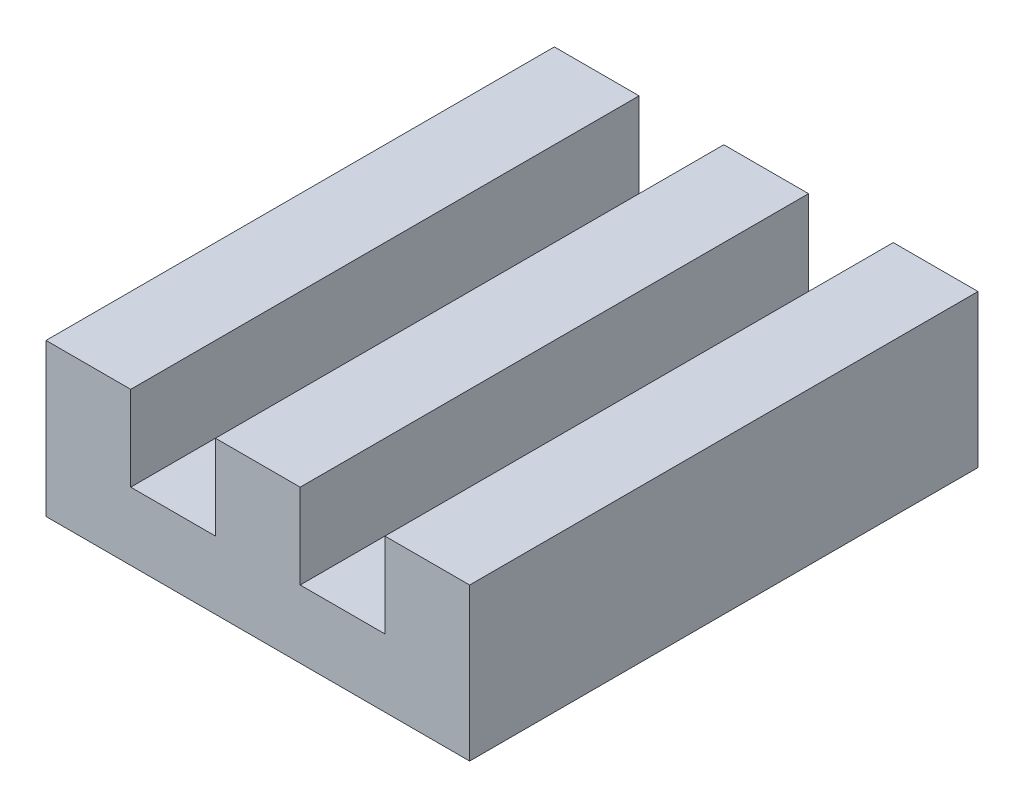
ISO-10303-21;
HEADER;
FILE_DESCRIPTION(('STEP AP214'),'2;1');
FILE_NAME('part.step','',(''),(''),'','','');
FILE_SCHEMA(('AUTOMOTIVE_DESIGN { 1 0 10303 214 1 1 1 1 }'));
ENDSEC;
DATA;
#1=APPLICATION_CONTEXT('core data for automotive mechanical design processes');
#2=APPLICATION_PROTOCOL_DEFINITION('international standard','automotive_design',2000,#1);
#3=PRODUCT_CONTEXT('',#1,'mechanical');
#4=PRODUCT('Part','Part','',(#3));
#5=PRODUCT_RELATED_PRODUCT_CATEGORY('part','',(#4));
#6=PRODUCT_DEFINITION_FORMATION('','',#4);
#7=PRODUCT_DEFINITION_CONTEXT('part definition',#1,'design');
#8=PRODUCT_DEFINITION('design','',#6,#7);
#9=PRODUCT_DEFINITION_SHAPE('','',#8);
#10=(LENGTH_UNIT() NAMED_UNIT(*) SI_UNIT(.MILLI.,.METRE.));
#11=(NAMED_UNIT(*) PLANE_ANGLE_UNIT() SI_UNIT($,.RADIAN.));
#12=(NAMED_UNIT(*) SI_UNIT($,.STERADIAN.) SOLID_ANGLE_UNIT());
#13=UNCERTAINTY_MEASURE_WITH_UNIT(LENGTH_MEASURE(1.E-05),#10,'distance_accuracy_value','');
#14=(GEOMETRIC_REPRESENTATION_CONTEXT(3) GLOBAL_UNCERTAINTY_ASSIGNED_CONTEXT((#13)) GLOBAL_UNIT_ASSIGNED_CONTEXT((#10,
#11,#12)) REPRESENTATION_CONTEXT('',''));
#15=CARTESIAN_POINT('',(0.,0.,0.));
#16=DIRECTION('',(0.,0.,1.));
#17=DIRECTION('',(1.,0.,0.));
#18=AXIS2_PLACEMENT_3D('',#15,#16,#17);
#19=CARTESIAN_POINT('',(50.,18.,60.));
#20=DIRECTION('',(0.,-1.,0.));
#21=DIRECTION('',(1.,0.,0.));
#22=AXIS2_PLACEMENT_3D('',#19,#20,#21);
#23=PLANE('',#22);
#24=DIRECTION('',(-1.,0.,0.));
#25=VECTOR('',#24,1.);
#26=CARTESIAN_POINT('',(50.,18.,60.));
#27=LINE('',#26,#25);
#28=CARTESIAN_POINT('',(30.,18.,60.));
#29=VERTEX_POINT('',#28);
#30=CARTESIAN_POINT('',(20.,18.,60.));
#31=VERTEX_POINT('',#30);
#32=EDGE_CURVE('E137',#29,#31,#27,.T.);
#33=ORIENTED_EDGE('',*,*,#32,.F.);
#34=DIRECTION('',(0.,0.,1.));
#35=VECTOR('',#34,1.);
#36=CARTESIAN_POINT('',(30.,18.,-4.94652419989347));
#37=LINE('',#36,#35);
#38=CARTESIAN_POINT('',(30.,18.,0.));
#39=VERTEX_POINT('',#38);
#40=EDGE_CURVE('E125',#39,#29,#37,.T.);
#41=ORIENTED_EDGE('',*,*,#40,.F.);
#42=DIRECTION('',(-1.,0.,0.));
#43=VECTOR('',#42,1.);
#44=CARTESIAN_POINT('',(50.,18.,0.));
#45=LINE('',#44,#43);
#46=CARTESIAN_POINT('',(20.,18.,0.));
#47=VERTEX_POINT('',#46);
#48=EDGE_CURVE('E135',#39,#47,#45,.T.);
#49=ORIENTED_EDGE('',*,*,#48,.T.);
#50=DIRECTION('',(0.,0.,-1.));
#51=VECTOR('',#50,1.);
#52=CARTESIAN_POINT('',(20.,18.,-4.94652419989347));
#53=LINE('',#52,#51);
#54=EDGE_CURVE('E209',#31,#47,#53,.T.);
#55=ORIENTED_EDGE('',*,*,#54,.F.);
#56=EDGE_LOOP('',(#33,#41,#49,#55));
#57=FACE_BOUND('',#56,.T.);
#58=ADVANCED_FACE('F35',(#57),#23,.F.);
#59=CARTESIAN_POINT('',(10.,18.,60.));
#60=VERTEX_POINT('',#59);
#61=CARTESIAN_POINT('',(0.,18.,60.));
#62=VERTEX_POINT('',#61);
#63=EDGE_CURVE('E196',#60,#62,#27,.T.);
#64=ORIENTED_EDGE('',*,*,#63,.F.);
#65=DIRECTION('',(0.,0.,1.));
#66=VECTOR('',#65,1.);
#67=CARTESIAN_POINT('',(10.,18.,-4.94652419989347));
#68=LINE('',#67,#66);
#69=CARTESIAN_POINT('',(10.,18.,0.));
#70=VERTEX_POINT('',#69);
#71=EDGE_CURVE('E212',#70,#60,#68,.T.);
#72=ORIENTED_EDGE('',*,*,#71,.F.);
#73=CARTESIAN_POINT('',(0.,18.,0.));
#74=VERTEX_POINT('',#73);
#75=EDGE_CURVE('E145',#70,#74,#45,.T.);
#76=ORIENTED_EDGE('',*,*,#75,.T.);
#77=DIRECTION('',(0.,0.,-1.));
#78=VECTOR('',#77,1.);
#79=CARTESIAN_POINT('',(0.,18.,60.));
#80=LINE('',#79,#78);
#81=EDGE_CURVE('E153',#62,#74,#80,.T.);
#82=ORIENTED_EDGE('',*,*,#81,.F.);
#83=EDGE_LOOP('',(#64,#72,#76,#82));
#84=FACE_BOUND('',#83,.T.);
#85=ADVANCED_FACE('F241',(#84),#23,.F.);
#86=CARTESIAN_POINT('',(0.,18.,60.));
#87=DIRECTION('',(1.,0.,0.));
#88=DIRECTION('',(0.,1.,0.));
#89=AXIS2_PLACEMENT_3D('',#86,#87,#88);
#90=PLANE('',#89);
#91=DIRECTION('',(0.,-1.,0.));
#92=VECTOR('',#91,1.);
#93=CARTESIAN_POINT('',(0.,18.,0.));
#94=LINE('',#93,#92);
#95=CARTESIAN_POINT('',(0.,0.,0.));
#96=VERTEX_POINT('',#95);
#97=EDGE_CURVE('E189',#74,#96,#94,.T.);
#98=ORIENTED_EDGE('',*,*,#97,.T.);
#99=DIRECTION('',(0.,0.,-1.));
#100=VECTOR('',#99,1.);
#101=CARTESIAN_POINT('',(0.,0.,60.));
#102=LINE('',#101,#100);
#103=CARTESIAN_POINT('',(0.,0.,60.));
#104=VERTEX_POINT('',#103);
#105=EDGE_CURVE('E163',#104,#96,#102,.T.);
#106=ORIENTED_EDGE('',*,*,#105,.F.);
#107=DIRECTION('',(0.,-1.,0.));
#108=VECTOR('',#107,1.);
#109=CARTESIAN_POINT('',(0.,18.,60.));
#110=LINE('',#109,#108);
#111=EDGE_CURVE('E148',#62,#104,#110,.T.);
#112=ORIENTED_EDGE('',*,*,#111,.F.);
#113=ORIENTED_EDGE('',*,*,#81,.T.);
#114=EDGE_LOOP('',(#98,#106,#112,#113));
#115=FACE_BOUND('',#114,.T.);
#116=ADVANCED_FACE('F37',(#115),#90,.F.);
#117=CARTESIAN_POINT('',(0.,0.,60.));
#118=DIRECTION('',(0.,1.,0.));
#119=DIRECTION('',(0.,0.,1.));
#120=AXIS2_PLACEMENT_3D('',#117,#118,#119);
#121=PLANE('',#120);
#122=DIRECTION('',(1.,0.,0.));
#123=VECTOR('',#122,1.);
#124=CARTESIAN_POINT('',(0.,0.,0.));
#125=LINE('',#124,#123);
#126=CARTESIAN_POINT('',(50.,0.,0.));
#127=VERTEX_POINT('',#126);
#128=EDGE_CURVE('E188',#96,#127,#125,.T.);
#129=ORIENTED_EDGE('',*,*,#128,.T.);
#130=DIRECTION('',(0.,0.,-1.));
#131=VECTOR('',#130,1.);
#132=CARTESIAN_POINT('',(50.,0.,60.));
#133=LINE('',#132,#131);
#134=CARTESIAN_POINT('',(50.,0.,60.));
#135=VERTEX_POINT('',#134);
#136=EDGE_CURVE('E160',#135,#127,#133,.T.);
#137=ORIENTED_EDGE('',*,*,#136,.F.);
#138=DIRECTION('',(1.,0.,0.));
#139=VECTOR('',#138,1.);
#140=CARTESIAN_POINT('',(0.,0.,60.));
#141=LINE('',#140,#139);
#142=EDGE_CURVE('E198',#104,#135,#141,.T.);
#143=ORIENTED_EDGE('',*,*,#142,.F.);
#144=ORIENTED_EDGE('',*,*,#105,.T.);
#145=EDGE_LOOP('',(#129,#137,#143,#144));
#146=FACE_BOUND('',#145,.T.);
#147=ADVANCED_FACE('F255',(#146),#121,.F.);
#148=CARTESIAN_POINT('',(50.,9.,60.));
#149=DIRECTION('',(-1.,0.,0.));
#150=DIRECTION('',(0.,0.,1.));
#151=AXIS2_PLACEMENT_3D('',#148,#149,#150);
#152=PLANE('',#151);
#153=DIRECTION('',(0.,1.,0.));
#154=VECTOR('',#153,1.);
#155=CARTESIAN_POINT('',(50.,9.,0.));
#156=LINE('',#155,#154);
#157=CARTESIAN_POINT('',(50.,18.,0.));
#158=VERTEX_POINT('',#157);
#159=EDGE_CURVE('E149',#127,#158,#156,.T.);
#160=ORIENTED_EDGE('',*,*,#159,.T.);
#161=DIRECTION('',(0.,0.,-1.));
#162=VECTOR('',#161,1.);
#163=CARTESIAN_POINT('',(50.,18.,60.));
#164=LINE('',#163,#162);
#165=CARTESIAN_POINT('',(50.,18.,60.));
#166=VERTEX_POINT('',#165);
#167=EDGE_CURVE('E156',#166,#158,#164,.T.);
#168=ORIENTED_EDGE('',*,*,#167,.F.);
#169=DIRECTION('',(0.,1.,0.));
#170=VECTOR('',#169,1.);
#171=CARTESIAN_POINT('',(50.,0.,60.));
#172=LINE('',#171,#170);
#173=EDGE_CURVE('E185',#135,#166,#172,.T.);
#174=ORIENTED_EDGE('',*,*,#173,.F.);
#175=ORIENTED_EDGE('',*,*,#136,.T.);
#176=EDGE_LOOP('',(#160,#168,#174,#175));
#177=FACE_BOUND('',#176,.T.);
#178=ADVANCED_FACE('F184',(#177),#152,.F.);
#179=CARTESIAN_POINT('',(40.,18.,0.));
#180=VERTEX_POINT('',#179);
#181=EDGE_CURVE('E144',#158,#180,#45,.T.);
#182=ORIENTED_EDGE('',*,*,#181,.T.);
#183=DIRECTION('',(0.,0.,-1.));
#184=VECTOR('',#183,1.);
#185=CARTESIAN_POINT('',(40.,18.,-4.94652419989347));
#186=LINE('',#185,#184);
#187=CARTESIAN_POINT('',(40.,18.,60.));
#188=VERTEX_POINT('',#187);
#189=EDGE_CURVE('E138',#188,#180,#186,.T.);
#190=ORIENTED_EDGE('',*,*,#189,.F.);
#191=EDGE_CURVE('E157',#166,#188,#27,.T.);
#192=ORIENTED_EDGE('',*,*,#191,.F.);
#193=ORIENTED_EDGE('',*,*,#167,.T.);
#194=EDGE_LOOP('',(#182,#190,#192,#193));
#195=FACE_BOUND('',#194,.T.);
#196=ADVANCED_FACE('F178',(#195),#23,.F.);
#197=CARTESIAN_POINT('',(0.,0.,60.));
#198=DIRECTION('',(0.,0.,1.));
#199=DIRECTION('',(1.,0.,0.));
#200=AXIS2_PLACEMENT_3D('',#197,#198,#199);
#201=PLANE('',#200);
#202=DIRECTION('',(0.,-1.,0.));
#203=VECTOR('',#202,1.);
#204=CARTESIAN_POINT('',(30.,0.,60.));
#205=LINE('',#204,#203);
#206=CARTESIAN_POINT('',(30.,8.,60.));
#207=VERTEX_POINT('',#206);
#208=EDGE_CURVE('E214',#29,#207,#205,.T.);
#209=ORIENTED_EDGE('',*,*,#208,.F.);
#210=ORIENTED_EDGE('',*,*,#32,.T.);
#211=DIRECTION('',(0.,1.,0.));
#212=VECTOR('',#211,1.);
#213=CARTESIAN_POINT('',(20.,0.,60.));
#214=LINE('',#213,#212);
#215=CARTESIAN_POINT('',(20.,8.,60.));
#216=VERTEX_POINT('',#215);
#217=EDGE_CURVE('E203',#216,#31,#214,.T.);
#218=ORIENTED_EDGE('',*,*,#217,.F.);
#219=DIRECTION('',(-1.,0.,0.));
#220=VECTOR('',#219,1.);
#221=CARTESIAN_POINT('',(0.,7.99999999999999,60.));
#222=LINE('',#221,#220);
#223=CARTESIAN_POINT('',(10.,8.,60.));
#224=VERTEX_POINT('',#223);
#225=EDGE_CURVE('E206',#216,#224,#222,.T.);
#226=ORIENTED_EDGE('',*,*,#225,.T.);
#227=DIRECTION('',(0.,-1.,0.));
#228=VECTOR('',#227,1.);
#229=CARTESIAN_POINT('',(10.,0.,60.));
#230=LINE('',#229,#228);
#231=EDGE_CURVE('E192',#60,#224,#230,.T.);
#232=ORIENTED_EDGE('',*,*,#231,.F.);
#233=ORIENTED_EDGE('',*,*,#63,.T.);
#234=ORIENTED_EDGE('',*,*,#111,.T.);
#235=ORIENTED_EDGE('',*,*,#142,.T.);
#236=ORIENTED_EDGE('',*,*,#173,.T.);
#237=ORIENTED_EDGE('',*,*,#191,.T.);
#238=DIRECTION('',(0.,1.,0.));
#239=VECTOR('',#238,1.);
#240=CARTESIAN_POINT('',(40.,0.,60.));
#241=LINE('',#240,#239);
#242=CARTESIAN_POINT('',(40.,8.00000000000001,60.));
#243=VERTEX_POINT('',#242);
#244=EDGE_CURVE('E219',#243,#188,#241,.T.);
#245=ORIENTED_EDGE('',*,*,#244,.F.);
#246=DIRECTION('',(-1.,0.,0.));
#247=VECTOR('',#246,1.);
#248=CARTESIAN_POINT('',(0.,7.99999999999999,60.));
#249=LINE('',#248,#247);
#250=EDGE_CURVE('E221',#243,#207,#249,.T.);
#251=ORIENTED_EDGE('',*,*,#250,.T.);
#252=EDGE_LOOP('',(#209,#210,#218,#226,#232,#233,#234,#235,#236,#237,#245,#251));
#253=FACE_BOUND('',#252,.T.);
#254=ADVANCED_FACE('F229',(#253),#201,.T.);
#255=CARTESIAN_POINT('',(0.,0.,0.));
#256=DIRECTION('',(0.,0.,1.));
#257=DIRECTION('',(1.,0.,0.));
#258=AXIS2_PLACEMENT_3D('',#255,#256,#257);
#259=PLANE('',#258);
#260=ORIENTED_EDGE('',*,*,#48,.F.);
#261=DIRECTION('',(0.,-1.,0.));
#262=VECTOR('',#261,1.);
#263=CARTESIAN_POINT('',(30.,0.,0.));
#264=LINE('',#263,#262);
#265=CARTESIAN_POINT('',(30.,8.,0.));
#266=VERTEX_POINT('',#265);
#267=EDGE_CURVE('E11',#39,#266,#264,.T.);
#268=ORIENTED_EDGE('',*,*,#267,.T.);
#269=DIRECTION('',(-1.,0.,0.));
#270=VECTOR('',#269,1.);
#271=CARTESIAN_POINT('',(0.,7.99999999999999,0.));
#272=LINE('',#271,#270);
#273=CARTESIAN_POINT('',(40.,8.00000000000001,0.));
#274=VERTEX_POINT('',#273);
#275=EDGE_CURVE('E172',#274,#266,#272,.T.);
#276=ORIENTED_EDGE('',*,*,#275,.F.);
#277=DIRECTION('',(0.,1.,0.));
#278=VECTOR('',#277,1.);
#279=CARTESIAN_POINT('',(40.,0.,0.));
#280=LINE('',#279,#278);
#281=EDGE_CURVE('E43',#274,#180,#280,.T.);
#282=ORIENTED_EDGE('',*,*,#281,.T.);
#283=ORIENTED_EDGE('',*,*,#181,.F.);
#284=ORIENTED_EDGE('',*,*,#159,.F.);
#285=ORIENTED_EDGE('',*,*,#128,.F.);
#286=ORIENTED_EDGE('',*,*,#97,.F.);
#287=ORIENTED_EDGE('',*,*,#75,.F.);
#288=DIRECTION('',(0.,-1.,0.));
#289=VECTOR('',#288,1.);
#290=CARTESIAN_POINT('',(10.,0.,0.));
#291=LINE('',#290,#289);
#292=CARTESIAN_POINT('',(10.,8.,0.));
#293=VERTEX_POINT('',#292);
#294=EDGE_CURVE('E169',#70,#293,#291,.T.);
#295=ORIENTED_EDGE('',*,*,#294,.T.);
#296=DIRECTION('',(-1.,0.,0.));
#297=VECTOR('',#296,1.);
#298=CARTESIAN_POINT('',(0.,7.99999999999999,0.));
#299=LINE('',#298,#297);
#300=CARTESIAN_POINT('',(20.,8.,0.));
#301=VERTEX_POINT('',#300);
#302=EDGE_CURVE('E166',#301,#293,#299,.T.);
#303=ORIENTED_EDGE('',*,*,#302,.F.);
#304=DIRECTION('',(0.,1.,0.));
#305=VECTOR('',#304,1.);
#306=CARTESIAN_POINT('',(20.,0.,0.));
#307=LINE('',#306,#305);
#308=EDGE_CURVE('E143',#301,#47,#307,.T.);
#309=ORIENTED_EDGE('',*,*,#308,.T.);
#310=EDGE_LOOP('',(#260,#268,#276,#282,#283,#284,#285,#286,#287,#295,#303,#309));
#311=FACE_BOUND('',#310,.T.);
#312=ADVANCED_FACE('F141',(#311),#259,.F.);
#313=CARTESIAN_POINT('',(10.,8.,-4.94652419989347));
#314=DIRECTION('',(-1.,0.,0.));
#315=DIRECTION('',(0.,-1.,0.));
#316=AXIS2_PLACEMENT_3D('',#313,#314,#315);
#317=PLANE('',#316);
#318=ORIENTED_EDGE('',*,*,#231,.T.);
#319=DIRECTION('',(0.,0.,1.));
#320=VECTOR('',#319,1.);
#321=CARTESIAN_POINT('',(10.,8.,-4.94652419989347));
#322=LINE('',#321,#320);
#323=EDGE_CURVE('E211',#293,#224,#322,.T.);
#324=ORIENTED_EDGE('',*,*,#323,.F.);
#325=ORIENTED_EDGE('',*,*,#294,.F.);
#326=ORIENTED_EDGE('',*,*,#71,.T.);
#327=EDGE_LOOP('',(#318,#324,#325,#326));
#328=FACE_BOUND('',#327,.T.);
#329=ADVANCED_FACE('F274',(#328),#317,.F.);
#330=CARTESIAN_POINT('',(20.,8.,-4.94652419989347));
#331=DIRECTION('',(1.,0.,0.));
#332=DIRECTION('',(0.,1.,0.));
#333=AXIS2_PLACEMENT_3D('',#330,#331,#332);
#334=PLANE('',#333);
#335=ORIENTED_EDGE('',*,*,#217,.T.);
#336=ORIENTED_EDGE('',*,*,#54,.T.);
#337=ORIENTED_EDGE('',*,*,#308,.F.);
#338=DIRECTION('',(0.,0.,-1.));
#339=VECTOR('',#338,1.);
#340=CARTESIAN_POINT('',(20.,8.,-4.94652419989347));
#341=LINE('',#340,#339);
#342=EDGE_CURVE('E58',#216,#301,#341,.T.);
#343=ORIENTED_EDGE('',*,*,#342,.F.);
#344=EDGE_LOOP('',(#335,#336,#337,#343));
#345=FACE_BOUND('',#344,.T.);
#346=ADVANCED_FACE('F278',(#345),#334,.F.);
#347=CARTESIAN_POINT('',(0.,7.99999999999999,0.));
#348=DIRECTION('',(0.,1.,0.));
#349=DIRECTION('',(-1.,0.,0.));
#350=AXIS2_PLACEMENT_3D('',#347,#348,#349);
#351=PLANE('',#350);
#352=ORIENTED_EDGE('',*,*,#342,.T.);
#353=ORIENTED_EDGE('',*,*,#302,.T.);
#354=ORIENTED_EDGE('',*,*,#323,.T.);
#355=ORIENTED_EDGE('',*,*,#225,.F.);
#356=EDGE_LOOP('',(#352,#353,#354,#355));
#357=FACE_BOUND('',#356,.T.);
#358=ADVANCED_FACE('F238',(#357),#351,.T.);
#359=CARTESIAN_POINT('',(30.,8.,-4.94652419989347));
#360=DIRECTION('',(-1.,0.,0.));
#361=DIRECTION('',(0.,-1.,0.));
#362=AXIS2_PLACEMENT_3D('',#359,#360,#361);
#363=PLANE('',#362);
#364=ORIENTED_EDGE('',*,*,#208,.T.);
#365=DIRECTION('',(0.,0.,1.));
#366=VECTOR('',#365,1.);
#367=CARTESIAN_POINT('',(30.,8.,-4.94652419989347));
#368=LINE('',#367,#366);
#369=EDGE_CURVE('E128',#266,#207,#368,.T.);
#370=ORIENTED_EDGE('',*,*,#369,.F.);
#371=ORIENTED_EDGE('',*,*,#267,.F.);
#372=ORIENTED_EDGE('',*,*,#40,.T.);
#373=EDGE_LOOP('',(#364,#370,#371,#372));
#374=FACE_BOUND('',#373,.T.);
#375=ADVANCED_FACE('F124',(#374),#363,.F.);
#376=CARTESIAN_POINT('',(40.,8.00000000000001,-4.94652419989347));
#377=DIRECTION('',(1.,0.,0.));
#378=DIRECTION('',(0.,1.,0.));
#379=AXIS2_PLACEMENT_3D('',#376,#377,#378);
#380=PLANE('',#379);
#381=ORIENTED_EDGE('',*,*,#244,.T.);
#382=ORIENTED_EDGE('',*,*,#189,.T.);
#383=ORIENTED_EDGE('',*,*,#281,.F.);
#384=DIRECTION('',(0.,0.,-1.));
#385=VECTOR('',#384,1.);
#386=CARTESIAN_POINT('',(40.,8.00000000000001,-4.94652419989347));
#387=LINE('',#386,#385);
#388=EDGE_CURVE('E50',#243,#274,#387,.T.);
#389=ORIENTED_EDGE('',*,*,#388,.F.);
#390=EDGE_LOOP('',(#381,#382,#383,#389));
#391=FACE_BOUND('',#390,.T.);
#392=ADVANCED_FACE('F230',(#391),#380,.F.);
#393=CARTESIAN_POINT('',(0.,7.99999999999999,0.));
#394=DIRECTION('',(0.,1.,0.));
#395=DIRECTION('',(-1.,0.,0.));
#396=AXIS2_PLACEMENT_3D('',#393,#394,#395);
#397=PLANE('',#396);
#398=ORIENTED_EDGE('',*,*,#388,.T.);
#399=ORIENTED_EDGE('',*,*,#275,.T.);
#400=ORIENTED_EDGE('',*,*,#369,.T.);
#401=ORIENTED_EDGE('',*,*,#250,.F.);
#402=EDGE_LOOP('',(#398,#399,#400,#401));
#403=FACE_BOUND('',#402,.T.);
#404=ADVANCED_FACE('F226',(#403),#397,.T.);
#405=CLOSED_SHELL('',(#58,#85,#116,#147,#178,#196,#254,#312,#329,#346,#358,#375,#392,#404));
#406=MANIFOLD_SOLID_BREP('B2',#405);
#407=ADVANCED_BREP_SHAPE_REPRESENTATION('',(#18,#406),#14);
#408=SHAPE_DEFINITION_REPRESENTATION(#9,#407);
ENDSEC;
END-ISO-10303-21;
